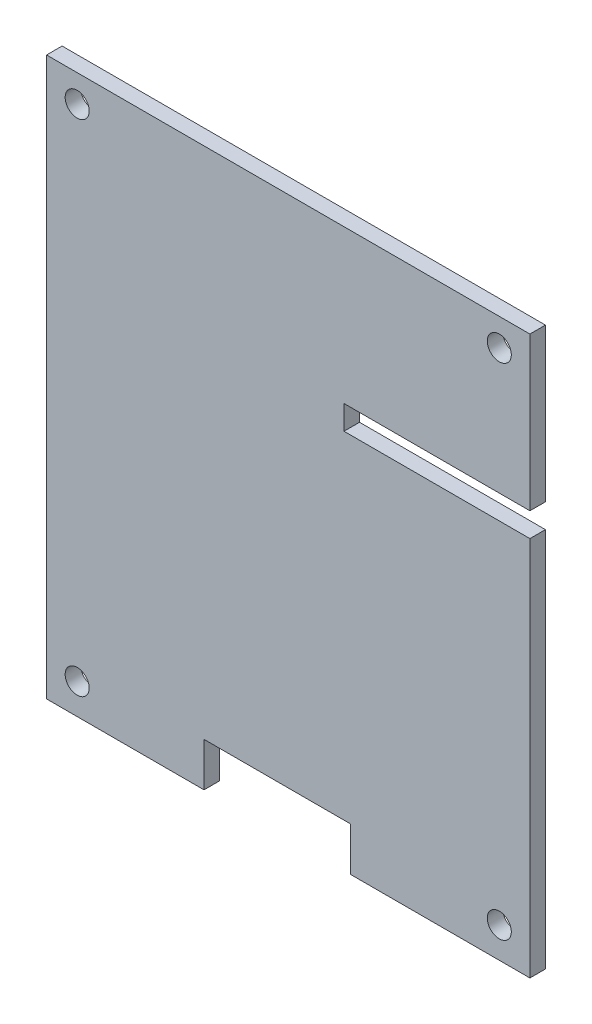
ISO-10303-21;
HEADER;
FILE_DESCRIPTION(('STEP AP214'),'2;1');
FILE_NAME('part.step','',(''),(''),'','','');
FILE_SCHEMA(('AUTOMOTIVE_DESIGN { 1 0 10303 214 1 1 1 1 }'));
ENDSEC;
DATA;
#1=APPLICATION_CONTEXT('core data for automotive mechanical design processes');
#2=APPLICATION_PROTOCOL_DEFINITION('international standard','automotive_design',2000,#1);
#3=PRODUCT_CONTEXT('',#1,'mechanical');
#4=PRODUCT('Part','Part','',(#3));
#5=PRODUCT_RELATED_PRODUCT_CATEGORY('part','',(#4));
#6=PRODUCT_DEFINITION_FORMATION('','',#4);
#7=PRODUCT_DEFINITION_CONTEXT('part definition',#1,'design');
#8=PRODUCT_DEFINITION('design','',#6,#7);
#9=PRODUCT_DEFINITION_SHAPE('','',#8);
#10=(LENGTH_UNIT() NAMED_UNIT(*) SI_UNIT(.MILLI.,.METRE.));
#11=(NAMED_UNIT(*) PLANE_ANGLE_UNIT() SI_UNIT($,.RADIAN.));
#12=(NAMED_UNIT(*) SI_UNIT($,.STERADIAN.) SOLID_ANGLE_UNIT());
#13=UNCERTAINTY_MEASURE_WITH_UNIT(LENGTH_MEASURE(1.E-05),#10,'distance_accuracy_value','');
#14=(GEOMETRIC_REPRESENTATION_CONTEXT(3) GLOBAL_UNCERTAINTY_ASSIGNED_CONTEXT((#13)) GLOBAL_UNIT_ASSIGNED_CONTEXT((#10,
#11,#12)) REPRESENTATION_CONTEXT('',''));
#15=CARTESIAN_POINT('',(0.,0.,0.));
#16=DIRECTION('',(0.,0.,1.));
#17=DIRECTION('',(1.,0.,0.));
#18=AXIS2_PLACEMENT_3D('',#15,#16,#17);
#19=CARTESIAN_POINT('',(0.,44.196,1.8034));
#20=DIRECTION('',(0.,1.,0.));
#21=DIRECTION('',(0.,0.,1.));
#22=AXIS2_PLACEMENT_3D('',#19,#20,#21);
#23=PLANE('',#22);
#24=DIRECTION('',(1.,0.,0.));
#25=VECTOR('',#24,1.);
#26=CARTESIAN_POINT('',(0.,44.196,0.));
#27=LINE('',#26,#25);
#28=CARTESIAN_POINT('',(-21.59,44.196,0.));
#29=VERTEX_POINT('',#28);
#30=CARTESIAN_POINT('',(0.,44.196,0.));
#31=VERTEX_POINT('',#30);
#32=EDGE_CURVE('E185',#29,#31,#27,.T.);
#33=ORIENTED_EDGE('',*,*,#32,.F.);
#34=DIRECTION('',(0.,0.,-1.));
#35=VECTOR('',#34,1.);
#36=CARTESIAN_POINT('',(-21.59,44.196,1.8034));
#37=LINE('',#36,#35);
#38=CARTESIAN_POINT('',(-21.59,44.196,1.8034));
#39=VERTEX_POINT('',#38);
#40=EDGE_CURVE('E11',#39,#29,#37,.T.);
#41=ORIENTED_EDGE('',*,*,#40,.F.);
#42=DIRECTION('',(1.,0.,0.));
#43=VECTOR('',#42,1.);
#44=CARTESIAN_POINT('',(0.,44.196,1.8034));
#45=LINE('',#44,#43);
#46=CARTESIAN_POINT('',(0.,44.196,1.8034));
#47=VERTEX_POINT('',#46);
#48=EDGE_CURVE('E222',#39,#47,#45,.T.);
#49=ORIENTED_EDGE('',*,*,#48,.T.);
#50=DIRECTION('',(0.,0.,-1.));
#51=VECTOR('',#50,1.);
#52=CARTESIAN_POINT('',(0.,44.196,1.8034));
#53=LINE('',#52,#51);
#54=EDGE_CURVE('E52',#47,#31,#53,.T.);
#55=ORIENTED_EDGE('',*,*,#54,.T.);
#56=EDGE_LOOP('',(#33,#41,#49,#55));
#57=FACE_BOUND('',#56,.T.);
#58=ADVANCED_FACE('F35',(#57),#23,.T.);
#59=CARTESIAN_POINT('',(-21.5899999999999,0.,1.8034));
#60=DIRECTION('',(1.,0.,0.));
#61=DIRECTION('',(0.,1.,0.));
#62=AXIS2_PLACEMENT_3D('',#59,#60,#61);
#63=PLANE('',#62);
#64=DIRECTION('',(0.,-1.,0.));
#65=VECTOR('',#64,1.);
#66=CARTESIAN_POINT('',(-21.5899999999999,0.,0.));
#67=LINE('',#66,#65);
#68=CARTESIAN_POINT('',(-21.59,46.99,0.));
#69=VERTEX_POINT('',#68);
#70=EDGE_CURVE('E182',#69,#29,#67,.T.);
#71=ORIENTED_EDGE('',*,*,#70,.F.);
#72=DIRECTION('',(0.,0.,-1.));
#73=VECTOR('',#72,1.);
#74=CARTESIAN_POINT('',(-21.59,46.99,1.8034));
#75=LINE('',#74,#73);
#76=CARTESIAN_POINT('',(-21.59,46.99,1.8034));
#77=VERTEX_POINT('',#76);
#78=EDGE_CURVE('E44',#77,#69,#75,.T.);
#79=ORIENTED_EDGE('',*,*,#78,.F.);
#80=DIRECTION('',(0.,-1.,0.));
#81=VECTOR('',#80,1.);
#82=CARTESIAN_POINT('',(-21.5899999999999,0.,1.8034));
#83=LINE('',#82,#81);
#84=EDGE_CURVE('E221',#77,#39,#83,.T.);
#85=ORIENTED_EDGE('',*,*,#84,.T.);
#86=ORIENTED_EDGE('',*,*,#40,.T.);
#87=EDGE_LOOP('',(#71,#79,#85,#86));
#88=FACE_BOUND('',#87,.T.);
#89=ADVANCED_FACE('F183',(#88),#63,.T.);
#90=CARTESIAN_POINT('',(0.,46.99,1.8034));
#91=DIRECTION('',(0.,-1.,0.));
#92=DIRECTION('',(0.,0.,-1.));
#93=AXIS2_PLACEMENT_3D('',#90,#91,#92);
#94=PLANE('',#93);
#95=DIRECTION('',(-1.,0.,0.));
#96=VECTOR('',#95,1.);
#97=CARTESIAN_POINT('',(0.,46.99,0.));
#98=LINE('',#97,#96);
#99=CARTESIAN_POINT('',(0.,46.99,0.));
#100=VERTEX_POINT('',#99);
#101=EDGE_CURVE('E174',#100,#69,#98,.T.);
#102=ORIENTED_EDGE('',*,*,#101,.F.);
#103=DIRECTION('',(0.,0.,-1.));
#104=VECTOR('',#103,1.);
#105=CARTESIAN_POINT('',(0.,46.99,1.8034));
#106=LINE('',#105,#104);
#107=CARTESIAN_POINT('',(0.,46.99,1.8034));
#108=VERTEX_POINT('',#107);
#109=EDGE_CURVE('E167',#108,#100,#106,.T.);
#110=ORIENTED_EDGE('',*,*,#109,.F.);
#111=DIRECTION('',(-1.,0.,0.));
#112=VECTOR('',#111,1.);
#113=CARTESIAN_POINT('',(0.,46.99,1.8034));
#114=LINE('',#113,#112);
#115=EDGE_CURVE('E177',#108,#77,#114,.T.);
#116=ORIENTED_EDGE('',*,*,#115,.T.);
#117=ORIENTED_EDGE('',*,*,#78,.T.);
#118=EDGE_LOOP('',(#102,#110,#116,#117));
#119=FACE_BOUND('',#118,.T.);
#120=ADVANCED_FACE('F172',(#119),#94,.T.);
#121=CARTESIAN_POINT('',(0.,0.,1.8034));
#122=DIRECTION('',(1.,0.,0.));
#123=DIRECTION('',(0.,0.,-1.));
#124=AXIS2_PLACEMENT_3D('',#121,#122,#123);
#125=PLANE('',#124);
#126=DIRECTION('',(0.,-1.,0.));
#127=VECTOR('',#126,1.);
#128=CARTESIAN_POINT('',(0.,0.,0.));
#129=LINE('',#128,#127);
#130=CARTESIAN_POINT('',(0.,64.77,0.));
#131=VERTEX_POINT('',#130);
#132=EDGE_CURVE('E190',#131,#100,#129,.T.);
#133=ORIENTED_EDGE('',*,*,#132,.F.);
#134=DIRECTION('',(0.,0.,-1.));
#135=VECTOR('',#134,1.);
#136=CARTESIAN_POINT('',(0.,64.77,1.8034));
#137=LINE('',#136,#135);
#138=CARTESIAN_POINT('',(0.,64.77,1.8034));
#139=VERTEX_POINT('',#138);
#140=EDGE_CURVE('E165',#139,#131,#137,.T.);
#141=ORIENTED_EDGE('',*,*,#140,.F.);
#142=DIRECTION('',(0.,-1.,0.));
#143=VECTOR('',#142,1.);
#144=CARTESIAN_POINT('',(0.,0.,1.8034));
#145=LINE('',#144,#143);
#146=EDGE_CURVE('E212',#139,#108,#145,.T.);
#147=ORIENTED_EDGE('',*,*,#146,.T.);
#148=ORIENTED_EDGE('',*,*,#109,.T.);
#149=EDGE_LOOP('',(#133,#141,#147,#148));
#150=FACE_BOUND('',#149,.T.);
#151=ADVANCED_FACE('F259',(#150),#125,.T.);
#152=CARTESIAN_POINT('',(0.,64.77,1.8034));
#153=DIRECTION('',(0.,1.,0.));
#154=DIRECTION('',(0.,0.,1.));
#155=AXIS2_PLACEMENT_3D('',#152,#153,#154);
#156=PLANE('',#155);
#157=DIRECTION('',(1.,0.,0.));
#158=VECTOR('',#157,1.);
#159=CARTESIAN_POINT('',(0.,64.77,0.));
#160=LINE('',#159,#158);
#161=CARTESIAN_POINT('',(-56.134,64.77,0.));
#162=VERTEX_POINT('',#161);
#163=EDGE_CURVE('E192',#162,#131,#160,.T.);
#164=ORIENTED_EDGE('',*,*,#163,.F.);
#165=DIRECTION('',(0.,0.,-1.));
#166=VECTOR('',#165,1.);
#167=CARTESIAN_POINT('',(-56.134,64.77,1.8034));
#168=LINE('',#167,#166);
#169=CARTESIAN_POINT('',(-56.134,64.77,1.8034));
#170=VERTEX_POINT('',#169);
#171=EDGE_CURVE('E163',#170,#162,#168,.T.);
#172=ORIENTED_EDGE('',*,*,#171,.F.);
#173=DIRECTION('',(1.,0.,0.));
#174=VECTOR('',#173,1.);
#175=CARTESIAN_POINT('',(0.,64.77,1.8034));
#176=LINE('',#175,#174);
#177=EDGE_CURVE('E216',#170,#139,#176,.T.);
#178=ORIENTED_EDGE('',*,*,#177,.T.);
#179=ORIENTED_EDGE('',*,*,#140,.T.);
#180=EDGE_LOOP('',(#164,#172,#178,#179));
#181=FACE_BOUND('',#180,.T.);
#182=ADVANCED_FACE('F258',(#181),#156,.T.);
#183=CARTESIAN_POINT('',(-56.134,0.,1.8034));
#184=DIRECTION('',(1.,0.,0.));
#185=DIRECTION('',(0.,1.,0.));
#186=AXIS2_PLACEMENT_3D('',#183,#184,#185);
#187=PLANE('',#186);
#188=DIRECTION('',(0.,-1.,0.));
#189=VECTOR('',#188,1.);
#190=CARTESIAN_POINT('',(-56.134,0.,0.));
#191=LINE('',#190,#189);
#192=CARTESIAN_POINT('',(-56.134,0.,0.));
#193=VERTEX_POINT('',#192);
#194=EDGE_CURVE('E198',#162,#193,#191,.T.);
#195=ORIENTED_EDGE('',*,*,#194,.T.);
#196=DIRECTION('',(0.,0.,-1.));
#197=VECTOR('',#196,1.);
#198=CARTESIAN_POINT('',(-56.134,0.,1.8034));
#199=LINE('',#198,#197);
#200=CARTESIAN_POINT('',(-56.134,0.,1.8034));
#201=VERTEX_POINT('',#200);
#202=EDGE_CURVE('E160',#201,#193,#199,.T.);
#203=ORIENTED_EDGE('',*,*,#202,.F.);
#204=DIRECTION('',(0.,-1.,0.));
#205=VECTOR('',#204,1.);
#206=CARTESIAN_POINT('',(-56.134,0.,1.8034));
#207=LINE('',#206,#205);
#208=EDGE_CURVE('E220',#170,#201,#207,.T.);
#209=ORIENTED_EDGE('',*,*,#208,.F.);
#210=ORIENTED_EDGE('',*,*,#171,.T.);
#211=EDGE_LOOP('',(#195,#203,#209,#210));
#212=FACE_BOUND('',#211,.T.);
#213=ADVANCED_FACE('F255',(#212),#187,.F.);
#214=CARTESIAN_POINT('',(0.,0.,1.8034));
#215=DIRECTION('',(0.,1.,0.));
#216=DIRECTION('',(0.,0.,1.));
#217=AXIS2_PLACEMENT_3D('',#214,#215,#216);
#218=PLANE('',#217);
#219=DIRECTION('',(1.,0.,0.));
#220=VECTOR('',#219,1.);
#221=CARTESIAN_POINT('',(0.,0.,0.));
#222=LINE('',#221,#220);
#223=CARTESIAN_POINT('',(-37.846,0.,0.));
#224=VERTEX_POINT('',#223);
#225=EDGE_CURVE('E201',#193,#224,#222,.T.);
#226=ORIENTED_EDGE('',*,*,#225,.T.);
#227=DIRECTION('',(0.,0.,-1.));
#228=VECTOR('',#227,1.);
#229=CARTESIAN_POINT('',(-37.846,0.,1.8034));
#230=LINE('',#229,#228);
#231=CARTESIAN_POINT('',(-37.846,0.,1.8034));
#232=VERTEX_POINT('',#231);
#233=EDGE_CURVE('E157',#232,#224,#230,.T.);
#234=ORIENTED_EDGE('',*,*,#233,.F.);
#235=DIRECTION('',(1.,0.,0.));
#236=VECTOR('',#235,1.);
#237=CARTESIAN_POINT('',(0.,0.,1.8034));
#238=LINE('',#237,#236);
#239=EDGE_CURVE('E137',#201,#232,#238,.T.);
#240=ORIENTED_EDGE('',*,*,#239,.F.);
#241=ORIENTED_EDGE('',*,*,#202,.T.);
#242=EDGE_LOOP('',(#226,#234,#240,#241));
#243=FACE_BOUND('',#242,.T.);
#244=ADVANCED_FACE('F250',(#243),#218,.F.);
#245=CARTESIAN_POINT('',(-37.846,0.,1.8034));
#246=DIRECTION('',(-1.,0.,0.));
#247=DIRECTION('',(0.,0.,1.));
#248=AXIS2_PLACEMENT_3D('',#245,#246,#247);
#249=PLANE('',#248);
#250=DIRECTION('',(0.,1.,0.));
#251=VECTOR('',#250,1.);
#252=CARTESIAN_POINT('',(-37.846,0.,0.));
#253=LINE('',#252,#251);
#254=CARTESIAN_POINT('',(-37.846,5.08,0.));
#255=VERTEX_POINT('',#254);
#256=EDGE_CURVE('E204',#224,#255,#253,.T.);
#257=ORIENTED_EDGE('',*,*,#256,.T.);
#258=DIRECTION('',(0.,0.,-1.));
#259=VECTOR('',#258,1.);
#260=CARTESIAN_POINT('',(-37.846,5.08,1.8034));
#261=LINE('',#260,#259);
#262=CARTESIAN_POINT('',(-37.846,5.08,1.8034));
#263=VERTEX_POINT('',#262);
#264=EDGE_CURVE('E150',#263,#255,#261,.T.);
#265=ORIENTED_EDGE('',*,*,#264,.F.);
#266=DIRECTION('',(0.,1.,0.));
#267=VECTOR('',#266,1.);
#268=CARTESIAN_POINT('',(-37.846,0.,1.8034));
#269=LINE('',#268,#267);
#270=EDGE_CURVE('E440',#232,#263,#269,.T.);
#271=ORIENTED_EDGE('',*,*,#270,.F.);
#272=ORIENTED_EDGE('',*,*,#233,.T.);
#273=EDGE_LOOP('',(#257,#265,#271,#272));
#274=FACE_BOUND('',#273,.T.);
#275=ADVANCED_FACE('F244',(#274),#249,.F.);
#276=CARTESIAN_POINT('',(0.,5.08,1.8034));
#277=DIRECTION('',(0.,1.,0.));
#278=DIRECTION('',(0.,0.,1.));
#279=AXIS2_PLACEMENT_3D('',#276,#277,#278);
#280=PLANE('',#279);
#281=DIRECTION('',(1.,0.,0.));
#282=VECTOR('',#281,1.);
#283=CARTESIAN_POINT('',(0.,5.08,0.));
#284=LINE('',#283,#282);
#285=CARTESIAN_POINT('',(-20.828,5.08,0.));
#286=VERTEX_POINT('',#285);
#287=EDGE_CURVE('E208',#255,#286,#284,.T.);
#288=ORIENTED_EDGE('',*,*,#287,.T.);
#289=DIRECTION('',(0.,0.,-1.));
#290=VECTOR('',#289,1.);
#291=CARTESIAN_POINT('',(-20.828,5.08,1.8034));
#292=LINE('',#291,#290);
#293=CARTESIAN_POINT('',(-20.828,5.08,1.8034));
#294=VERTEX_POINT('',#293);
#295=EDGE_CURVE('E148',#294,#286,#292,.T.);
#296=ORIENTED_EDGE('',*,*,#295,.F.);
#297=DIRECTION('',(1.,0.,0.));
#298=VECTOR('',#297,1.);
#299=CARTESIAN_POINT('',(0.,5.08,1.8034));
#300=LINE('',#299,#298);
#301=EDGE_CURVE('E141',#263,#294,#300,.T.);
#302=ORIENTED_EDGE('',*,*,#301,.F.);
#303=ORIENTED_EDGE('',*,*,#264,.T.);
#304=EDGE_LOOP('',(#288,#296,#302,#303));
#305=FACE_BOUND('',#304,.T.);
#306=ADVANCED_FACE('F241',(#305),#280,.F.);
#307=CARTESIAN_POINT('',(-20.828,0.,1.8034));
#308=DIRECTION('',(1.,0.,0.));
#309=DIRECTION('',(0.,0.,-1.));
#310=AXIS2_PLACEMENT_3D('',#307,#308,#309);
#311=PLANE('',#310);
#312=DIRECTION('',(0.,-1.,0.));
#313=VECTOR('',#312,1.);
#314=CARTESIAN_POINT('',(-20.828,0.,0.));
#315=LINE('',#314,#313);
#316=CARTESIAN_POINT('',(-20.828,0.,0.));
#317=VERTEX_POINT('',#316);
#318=EDGE_CURVE('E147',#286,#317,#315,.T.);
#319=ORIENTED_EDGE('',*,*,#318,.T.);
#320=DIRECTION('',(0.,0.,-1.));
#321=VECTOR('',#320,1.);
#322=CARTESIAN_POINT('',(-20.828,0.,1.8034));
#323=LINE('',#322,#321);
#324=CARTESIAN_POINT('',(-20.828,0.,1.8034));
#325=VERTEX_POINT('',#324);
#326=EDGE_CURVE('E130',#325,#317,#323,.T.);
#327=ORIENTED_EDGE('',*,*,#326,.F.);
#328=DIRECTION('',(0.,-1.,0.));
#329=VECTOR('',#328,1.);
#330=CARTESIAN_POINT('',(-20.828,0.,1.8034));
#331=LINE('',#330,#329);
#332=EDGE_CURVE('E135',#294,#325,#331,.T.);
#333=ORIENTED_EDGE('',*,*,#332,.F.);
#334=ORIENTED_EDGE('',*,*,#295,.T.);
#335=EDGE_LOOP('',(#319,#327,#333,#334));
#336=FACE_BOUND('',#335,.T.);
#337=ADVANCED_FACE('F146',(#336),#311,.F.);
#338=CARTESIAN_POINT('',(0.,0.,0.));
#339=VERTEX_POINT('',#338);
#340=EDGE_CURVE('E205',#317,#339,#222,.T.);
#341=ORIENTED_EDGE('',*,*,#340,.T.);
#342=DIRECTION('',(0.,0.,-1.));
#343=VECTOR('',#342,1.);
#344=CARTESIAN_POINT('',(0.,0.,1.8034));
#345=LINE('',#344,#343);
#346=CARTESIAN_POINT('',(0.,0.,1.8034));
#347=VERTEX_POINT('',#346);
#348=EDGE_CURVE('E90',#347,#339,#345,.T.);
#349=ORIENTED_EDGE('',*,*,#348,.F.);
#350=EDGE_CURVE('E126',#325,#347,#238,.T.);
#351=ORIENTED_EDGE('',*,*,#350,.F.);
#352=ORIENTED_EDGE('',*,*,#326,.T.);
#353=EDGE_LOOP('',(#341,#349,#351,#352));
#354=FACE_BOUND('',#353,.T.);
#355=ADVANCED_FACE('F128',(#354),#218,.F.);
#356=CARTESIAN_POINT('',(-3.556,61.595,1.8034));
#357=DIRECTION('',(0.,0.,-1.));
#358=DIRECTION('',(-1.,0.,0.));
#359=AXIS2_PLACEMENT_3D('',#356,#357,#358);
#360=CYLINDRICAL_SURFACE('',#359,1.397);
#361=CARTESIAN_POINT('',(-3.556,61.595,1.8034));
#362=DIRECTION('',(0.,0.,1.));
#363=DIRECTION('',(1.,0.,0.));
#364=AXIS2_PLACEMENT_3D('',#361,#362,#363);
#365=CIRCLE('',#364,1.397);
#366=CARTESIAN_POINT('',(-2.159,61.595,1.8034));
#367=VERTEX_POINT('',#366);
#368=EDGE_CURVE('E226',#367,#367,#365,.T.);
#369=ORIENTED_EDGE('',*,*,#368,.T.);
#370=EDGE_LOOP('',(#369));
#371=FACE_BOUND('',#370,.T.);
#372=CARTESIAN_POINT('',(-3.556,61.595,0.));
#373=DIRECTION('',(0.,0.,1.));
#374=DIRECTION('',(1.,0.,0.));
#375=AXIS2_PLACEMENT_3D('',#372,#373,#374);
#376=CIRCLE('',#375,1.397);
#377=CARTESIAN_POINT('',(-2.159,61.595,0.));
#378=VERTEX_POINT('',#377);
#379=EDGE_CURVE('E292',#378,#378,#376,.T.);
#380=ORIENTED_EDGE('',*,*,#379,.F.);
#381=EDGE_LOOP('',(#380));
#382=FACE_BOUND('',#381,.T.);
#383=ADVANCED_FACE('F268',(#371,#382),#360,.F.);
#384=CARTESIAN_POINT('',(-3.556,3.556,1.8034));
#385=DIRECTION('',(0.,0.,-1.));
#386=DIRECTION('',(-1.,0.,0.));
#387=AXIS2_PLACEMENT_3D('',#384,#385,#386);
#388=CYLINDRICAL_SURFACE('',#387,1.397);
#389=CARTESIAN_POINT('',(-3.556,3.556,1.8034));
#390=DIRECTION('',(0.,0.,1.));
#391=DIRECTION('',(1.,0.,0.));
#392=AXIS2_PLACEMENT_3D('',#389,#390,#391);
#393=CIRCLE('',#392,1.397);
#394=CARTESIAN_POINT('',(-2.159,3.556,1.8034));
#395=VERTEX_POINT('',#394);
#396=EDGE_CURVE('E229',#395,#395,#393,.T.);
#397=ORIENTED_EDGE('',*,*,#396,.T.);
#398=EDGE_LOOP('',(#397));
#399=FACE_BOUND('',#398,.T.);
#400=CARTESIAN_POINT('',(-3.556,3.556,0.));
#401=DIRECTION('',(0.,0.,1.));
#402=DIRECTION('',(1.,0.,0.));
#403=AXIS2_PLACEMENT_3D('',#400,#401,#402);
#404=CIRCLE('',#403,1.397);
#405=CARTESIAN_POINT('',(-2.159,3.556,0.));
#406=VERTEX_POINT('',#405);
#407=EDGE_CURVE('E288',#406,#406,#404,.T.);
#408=ORIENTED_EDGE('',*,*,#407,.F.);
#409=EDGE_LOOP('',(#408));
#410=FACE_BOUND('',#409,.T.);
#411=ADVANCED_FACE('F271',(#399,#410),#388,.F.);
#412=CARTESIAN_POINT('',(-52.578,3.556,1.8034));
#413=DIRECTION('',(0.,0.,-1.));
#414=DIRECTION('',(-1.,0.,0.));
#415=AXIS2_PLACEMENT_3D('',#412,#413,#414);
#416=CYLINDRICAL_SURFACE('',#415,1.39699999999999);
#417=CARTESIAN_POINT('',(-52.578,3.556,1.8034));
#418=DIRECTION('',(0.,0.,1.));
#419=DIRECTION('',(1.,0.,0.));
#420=AXIS2_PLACEMENT_3D('',#417,#418,#419);
#421=CIRCLE('',#420,1.39699999999999);
#422=CARTESIAN_POINT('',(-51.181,3.556,1.8034));
#423=VERTEX_POINT('',#422);
#424=EDGE_CURVE('E232',#423,#423,#421,.T.);
#425=ORIENTED_EDGE('',*,*,#424,.T.);
#426=EDGE_LOOP('',(#425));
#427=FACE_BOUND('',#426,.T.);
#428=CARTESIAN_POINT('',(-52.578,3.556,0.));
#429=DIRECTION('',(0.,0.,1.));
#430=DIRECTION('',(1.,0.,0.));
#431=AXIS2_PLACEMENT_3D('',#428,#429,#430);
#432=CIRCLE('',#431,1.39699999999999);
#433=CARTESIAN_POINT('',(-51.181,3.556,0.));
#434=VERTEX_POINT('',#433);
#435=EDGE_CURVE('E286',#434,#434,#432,.T.);
#436=ORIENTED_EDGE('',*,*,#435,.F.);
#437=EDGE_LOOP('',(#436));
#438=FACE_BOUND('',#437,.T.);
#439=ADVANCED_FACE('F274',(#427,#438),#416,.F.);
#440=CARTESIAN_POINT('',(-52.578,61.595,1.8034));
#441=DIRECTION('',(0.,0.,-1.));
#442=DIRECTION('',(-1.,0.,0.));
#443=AXIS2_PLACEMENT_3D('',#440,#441,#442);
#444=CYLINDRICAL_SURFACE('',#443,1.397);
#445=CARTESIAN_POINT('',(-52.578,61.595,1.8034));
#446=DIRECTION('',(0.,0.,1.));
#447=DIRECTION('',(1.,0.,0.));
#448=AXIS2_PLACEMENT_3D('',#445,#446,#447);
#449=CIRCLE('',#448,1.397);
#450=CARTESIAN_POINT('',(-51.181,61.595,1.8034));
#451=VERTEX_POINT('',#450);
#452=EDGE_CURVE('E235',#451,#451,#449,.T.);
#453=ORIENTED_EDGE('',*,*,#452,.T.);
#454=EDGE_LOOP('',(#453));
#455=FACE_BOUND('',#454,.T.);
#456=CARTESIAN_POINT('',(-52.578,61.595,0.));
#457=DIRECTION('',(0.,0.,1.));
#458=DIRECTION('',(1.,0.,0.));
#459=AXIS2_PLACEMENT_3D('',#456,#457,#458);
#460=CIRCLE('',#459,1.397);
#461=CARTESIAN_POINT('',(-51.181,61.595,0.));
#462=VERTEX_POINT('',#461);
#463=EDGE_CURVE('E289',#462,#462,#460,.T.);
#464=ORIENTED_EDGE('',*,*,#463,.F.);
#465=EDGE_LOOP('',(#464));
#466=FACE_BOUND('',#465,.T.);
#467=ADVANCED_FACE('F37',(#455,#466),#444,.F.);
#468=EDGE_CURVE('E194',#31,#339,#129,.T.);
#469=ORIENTED_EDGE('',*,*,#468,.F.);
#470=ORIENTED_EDGE('',*,*,#54,.F.);
#471=EDGE_CURVE('E134',#47,#347,#145,.T.);
#472=ORIENTED_EDGE('',*,*,#471,.T.);
#473=ORIENTED_EDGE('',*,*,#348,.T.);
#474=EDGE_LOOP('',(#469,#470,#472,#473));
#475=FACE_BOUND('',#474,.T.);
#476=ADVANCED_FACE('F281',(#475),#125,.T.);
#477=CARTESIAN_POINT('',(0.,0.,1.8034));
#478=DIRECTION('',(0.,0.,1.));
#479=DIRECTION('',(1.,0.,0.));
#480=AXIS2_PLACEMENT_3D('',#477,#478,#479);
#481=PLANE('',#480);
#482=ORIENTED_EDGE('',*,*,#452,.F.);
#483=EDGE_LOOP('',(#482));
#484=FACE_BOUND('',#483,.T.);
#485=ORIENTED_EDGE('',*,*,#424,.F.);
#486=EDGE_LOOP('',(#485));
#487=FACE_BOUND('',#486,.T.);
#488=ORIENTED_EDGE('',*,*,#396,.F.);
#489=EDGE_LOOP('',(#488));
#490=FACE_BOUND('',#489,.T.);
#491=ORIENTED_EDGE('',*,*,#368,.F.);
#492=EDGE_LOOP('',(#491));
#493=FACE_BOUND('',#492,.T.);
#494=ORIENTED_EDGE('',*,*,#48,.F.);
#495=ORIENTED_EDGE('',*,*,#84,.F.);
#496=ORIENTED_EDGE('',*,*,#115,.F.);
#497=ORIENTED_EDGE('',*,*,#146,.F.);
#498=ORIENTED_EDGE('',*,*,#177,.F.);
#499=ORIENTED_EDGE('',*,*,#208,.T.);
#500=ORIENTED_EDGE('',*,*,#239,.T.);
#501=ORIENTED_EDGE('',*,*,#270,.T.);
#502=ORIENTED_EDGE('',*,*,#301,.T.);
#503=ORIENTED_EDGE('',*,*,#332,.T.);
#504=ORIENTED_EDGE('',*,*,#350,.T.);
#505=ORIENTED_EDGE('',*,*,#471,.F.);
#506=EDGE_LOOP('',(#494,#495,#496,#497,#498,#499,#500,#501,#502,#503,#504,#505));
#507=FACE_BOUND('',#506,.T.);
#508=ADVANCED_FACE('F139',(#484,#487,#490,#493,#507),#481,.T.);
#509=CARTESIAN_POINT('',(0.,0.,0.));
#510=DIRECTION('',(0.,0.,1.));
#511=DIRECTION('',(1.,0.,0.));
#512=AXIS2_PLACEMENT_3D('',#509,#510,#511);
#513=PLANE('',#512);
#514=ORIENTED_EDGE('',*,*,#463,.T.);
#515=EDGE_LOOP('',(#514));
#516=FACE_BOUND('',#515,.T.);
#517=ORIENTED_EDGE('',*,*,#435,.T.);
#518=EDGE_LOOP('',(#517));
#519=FACE_BOUND('',#518,.T.);
#520=ORIENTED_EDGE('',*,*,#407,.T.);
#521=EDGE_LOOP('',(#520));
#522=FACE_BOUND('',#521,.T.);
#523=ORIENTED_EDGE('',*,*,#379,.T.);
#524=EDGE_LOOP('',(#523));
#525=FACE_BOUND('',#524,.T.);
#526=ORIENTED_EDGE('',*,*,#32,.T.);
#527=ORIENTED_EDGE('',*,*,#468,.T.);
#528=ORIENTED_EDGE('',*,*,#340,.F.);
#529=ORIENTED_EDGE('',*,*,#318,.F.);
#530=ORIENTED_EDGE('',*,*,#287,.F.);
#531=ORIENTED_EDGE('',*,*,#256,.F.);
#532=ORIENTED_EDGE('',*,*,#225,.F.);
#533=ORIENTED_EDGE('',*,*,#194,.F.);
#534=ORIENTED_EDGE('',*,*,#163,.T.);
#535=ORIENTED_EDGE('',*,*,#132,.T.);
#536=ORIENTED_EDGE('',*,*,#101,.T.);
#537=ORIENTED_EDGE('',*,*,#70,.T.);
#538=EDGE_LOOP('',(#526,#527,#528,#529,#530,#531,#532,#533,#534,#535,#536,#537));
#539=FACE_BOUND('',#538,.T.);
#540=ADVANCED_FACE('F187',(#516,#519,#522,#525,#539),#513,.F.);
#541=CLOSED_SHELL('',(#58,#89,#120,#151,#182,#213,#244,#275,#306,#337,#355,#383,#411,#439,#467,
#476,#508,#540));
#542=MANIFOLD_SOLID_BREP('B2',#541);
#543=ADVANCED_BREP_SHAPE_REPRESENTATION('',(#18,#542),#14);
#544=SHAPE_DEFINITION_REPRESENTATION(#9,#543);
ENDSEC;
END-ISO-10303-21;
